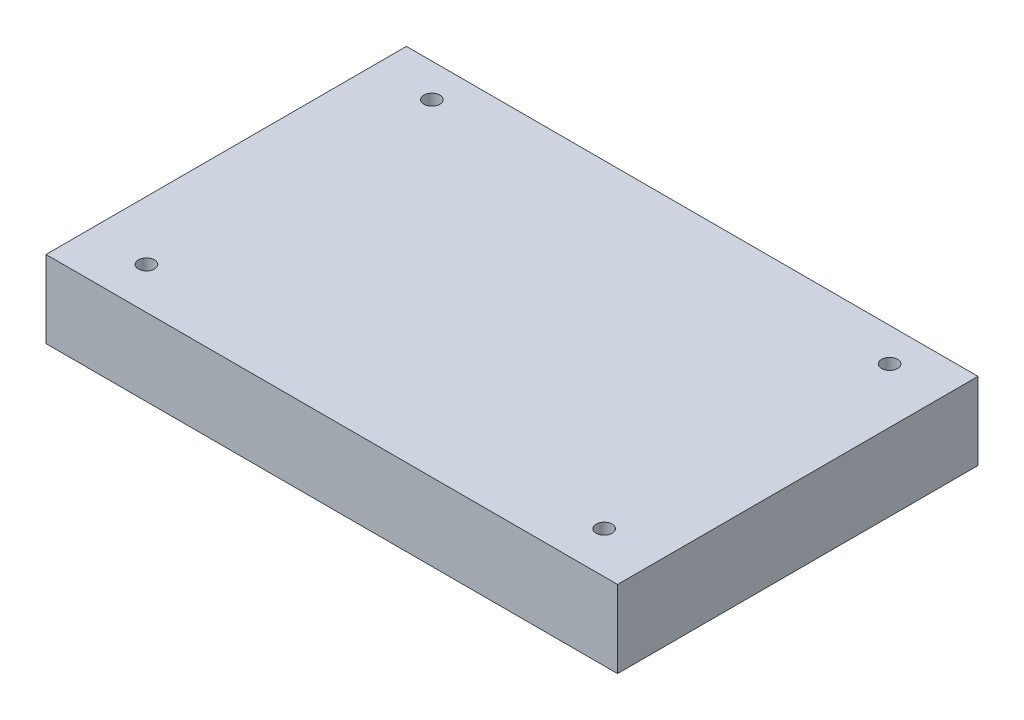
ISO-10303-21;
HEADER;
FILE_DESCRIPTION(('STEP AP214'),'2;1');
FILE_NAME('part.step','',(''),(''),'','','');
FILE_SCHEMA(('AUTOMOTIVE_DESIGN { 1 0 10303 214 1 1 1 1 }'));
ENDSEC;
DATA;
#1=APPLICATION_CONTEXT('core data for automotive mechanical design processes');
#2=APPLICATION_PROTOCOL_DEFINITION('international standard','automotive_design',2000,#1);
#3=PRODUCT_CONTEXT('',#1,'mechanical');
#4=PRODUCT('Part','Part','',(#3));
#5=PRODUCT_RELATED_PRODUCT_CATEGORY('part','',(#4));
#6=PRODUCT_DEFINITION_FORMATION('','',#4);
#7=PRODUCT_DEFINITION_CONTEXT('part definition',#1,'design');
#8=PRODUCT_DEFINITION('design','',#6,#7);
#9=PRODUCT_DEFINITION_SHAPE('','',#8);
#10=(LENGTH_UNIT() NAMED_UNIT(*) SI_UNIT(.MILLI.,.METRE.));
#11=(NAMED_UNIT(*) PLANE_ANGLE_UNIT() SI_UNIT($,.RADIAN.));
#12=(NAMED_UNIT(*) SI_UNIT($,.STERADIAN.) SOLID_ANGLE_UNIT());
#13=UNCERTAINTY_MEASURE_WITH_UNIT(LENGTH_MEASURE(1.E-05),#10,'distance_accuracy_value','');
#14=(GEOMETRIC_REPRESENTATION_CONTEXT(3) GLOBAL_UNCERTAINTY_ASSIGNED_CONTEXT((#13)) GLOBAL_UNIT_ASSIGNED_CONTEXT((#10,
#11,#12)) REPRESENTATION_CONTEXT('',''));
#15=CARTESIAN_POINT('',(0.,0.,0.));
#16=DIRECTION('',(0.,0.,1.));
#17=DIRECTION('',(1.,0.,0.));
#18=AXIS2_PLACEMENT_3D('',#15,#16,#17);
#19=CARTESIAN_POINT('',(55.5,15.,-35.));
#20=DIRECTION('',(-1.,0.,0.));
#21=DIRECTION('',(0.,0.,1.));
#22=AXIS2_PLACEMENT_3D('',#19,#20,#21);
#23=PLANE('',#22);
#24=DIRECTION('',(0.,0.,-1.));
#25=VECTOR('',#24,1.);
#26=CARTESIAN_POINT('',(55.5,0.,-35.));
#27=LINE('',#26,#25);
#28=CARTESIAN_POINT('',(55.5,0.,35.));
#29=VERTEX_POINT('',#28);
#30=CARTESIAN_POINT('',(55.5,0.,-35.));
#31=VERTEX_POINT('',#30);
#32=EDGE_CURVE('E96',#29,#31,#27,.T.);
#33=ORIENTED_EDGE('',*,*,#32,.T.);
#34=DIRECTION('',(0.,-1.,0.));
#35=VECTOR('',#34,1.);
#36=CARTESIAN_POINT('',(55.5,15.,-35.));
#37=LINE('',#36,#35);
#38=CARTESIAN_POINT('',(55.5,15.,-35.));
#39=VERTEX_POINT('',#38);
#40=EDGE_CURVE('E11',#39,#31,#37,.T.);
#41=ORIENTED_EDGE('',*,*,#40,.F.);
#42=DIRECTION('',(0.,0.,-1.));
#43=VECTOR('',#42,1.);
#44=CARTESIAN_POINT('',(55.5,15.,-35.));
#45=LINE('',#44,#43);
#46=CARTESIAN_POINT('',(55.5,15.,35.));
#47=VERTEX_POINT('',#46);
#48=EDGE_CURVE('E84',#47,#39,#45,.T.);
#49=ORIENTED_EDGE('',*,*,#48,.F.);
#50=DIRECTION('',(0.,-1.,0.));
#51=VECTOR('',#50,1.);
#52=CARTESIAN_POINT('',(55.5,15.,35.));
#53=LINE('',#52,#51);
#54=EDGE_CURVE('E92',#47,#29,#53,.T.);
#55=ORIENTED_EDGE('',*,*,#54,.T.);
#56=EDGE_LOOP('',(#33,#41,#49,#55));
#57=FACE_BOUND('',#56,.T.);
#58=ADVANCED_FACE('F33',(#57),#23,.F.);
#59=CARTESIAN_POINT('',(-55.5,15.,-35.));
#60=DIRECTION('',(0.,0.,1.));
#61=DIRECTION('',(1.,0.,0.));
#62=AXIS2_PLACEMENT_3D('',#59,#60,#61);
#63=PLANE('',#62);
#64=DIRECTION('',(-1.,0.,0.));
#65=VECTOR('',#64,1.);
#66=CARTESIAN_POINT('',(-55.5,0.,-35.));
#67=LINE('',#66,#65);
#68=CARTESIAN_POINT('',(-55.5,0.,-35.));
#69=VERTEX_POINT('',#68);
#70=EDGE_CURVE('E88',#31,#69,#67,.T.);
#71=ORIENTED_EDGE('',*,*,#70,.T.);
#72=DIRECTION('',(0.,-1.,0.));
#73=VECTOR('',#72,1.);
#74=CARTESIAN_POINT('',(-55.5,15.,-35.));
#75=LINE('',#74,#73);
#76=CARTESIAN_POINT('',(-55.5,15.,-35.));
#77=VERTEX_POINT('',#76);
#78=EDGE_CURVE('E41',#77,#69,#75,.T.);
#79=ORIENTED_EDGE('',*,*,#78,.F.);
#80=DIRECTION('',(-1.,0.,0.));
#81=VECTOR('',#80,1.);
#82=CARTESIAN_POINT('',(-55.5,15.,-35.));
#83=LINE('',#82,#81);
#84=EDGE_CURVE('E79',#39,#77,#83,.T.);
#85=ORIENTED_EDGE('',*,*,#84,.F.);
#86=ORIENTED_EDGE('',*,*,#40,.T.);
#87=EDGE_LOOP('',(#71,#79,#85,#86));
#88=FACE_BOUND('',#87,.T.);
#89=ADVANCED_FACE('F87',(#88),#63,.F.);
#90=CARTESIAN_POINT('',(-55.5,15.,-35.));
#91=DIRECTION('',(1.,0.,0.));
#92=DIRECTION('',(0.,0.,-1.));
#93=AXIS2_PLACEMENT_3D('',#90,#91,#92);
#94=PLANE('',#93);
#95=DIRECTION('',(0.,0.,1.));
#96=VECTOR('',#95,1.);
#97=CARTESIAN_POINT('',(-55.5,0.,-35.));
#98=LINE('',#97,#96);
#99=CARTESIAN_POINT('',(-55.5,0.,35.));
#100=VERTEX_POINT('',#99);
#101=EDGE_CURVE('E66',#69,#100,#98,.T.);
#102=ORIENTED_EDGE('',*,*,#101,.T.);
#103=DIRECTION('',(0.,-1.,0.));
#104=VECTOR('',#103,1.);
#105=CARTESIAN_POINT('',(-55.5,15.,35.));
#106=LINE('',#105,#104);
#107=CARTESIAN_POINT('',(-55.5,15.,35.));
#108=VERTEX_POINT('',#107);
#109=EDGE_CURVE('E89',#108,#100,#106,.T.);
#110=ORIENTED_EDGE('',*,*,#109,.F.);
#111=DIRECTION('',(0.,0.,1.));
#112=VECTOR('',#111,1.);
#113=CARTESIAN_POINT('',(-55.5,15.,-35.));
#114=LINE('',#113,#112);
#115=EDGE_CURVE('E82',#77,#108,#114,.T.);
#116=ORIENTED_EDGE('',*,*,#115,.F.);
#117=ORIENTED_EDGE('',*,*,#78,.T.);
#118=EDGE_LOOP('',(#102,#110,#116,#117));
#119=FACE_BOUND('',#118,.T.);
#120=ADVANCED_FACE('F90',(#119),#94,.F.);
#121=CARTESIAN_POINT('',(-55.5,15.,35.));
#122=DIRECTION('',(0.,0.,-1.));
#123=DIRECTION('',(-1.,0.,0.));
#124=AXIS2_PLACEMENT_3D('',#121,#122,#123);
#125=PLANE('',#124);
#126=DIRECTION('',(1.,0.,0.));
#127=VECTOR('',#126,1.);
#128=CARTESIAN_POINT('',(-55.5,0.,35.));
#129=LINE('',#128,#127);
#130=EDGE_CURVE('E72',#100,#29,#129,.T.);
#131=ORIENTED_EDGE('',*,*,#130,.T.);
#132=ORIENTED_EDGE('',*,*,#54,.F.);
#133=DIRECTION('',(1.,0.,0.));
#134=VECTOR('',#133,1.);
#135=CARTESIAN_POINT('',(-55.5,15.,35.));
#136=LINE('',#135,#134);
#137=EDGE_CURVE('E49',#108,#47,#136,.T.);
#138=ORIENTED_EDGE('',*,*,#137,.F.);
#139=ORIENTED_EDGE('',*,*,#109,.T.);
#140=EDGE_LOOP('',(#131,#132,#138,#139));
#141=FACE_BOUND('',#140,.T.);
#142=ADVANCED_FACE('F104',(#141),#125,.F.);
#143=CARTESIAN_POINT('',(0.,15.,0.));
#144=DIRECTION('',(0.,1.,0.));
#145=DIRECTION('',(0.,0.,1.));
#146=AXIS2_PLACEMENT_3D('',#143,#144,#145);
#147=PLANE('',#146);
#148=CARTESIAN_POINT('',(44.825,15.,-28.505));
#149=DIRECTION('',(0.,1.,0.));
#150=DIRECTION('',(0.,0.,1.));
#151=AXIS2_PLACEMENT_3D('',#148,#149,#150);
#152=CIRCLE('',#151,1.555);
#153=CARTESIAN_POINT('',(44.825,15.,-26.95));
#154=VERTEX_POINT('',#153);
#155=EDGE_CURVE('E128',#154,#154,#152,.T.);
#156=ORIENTED_EDGE('',*,*,#155,.F.);
#157=EDGE_LOOP('',(#156));
#158=FACE_BOUND('',#157,.T.);
#159=CARTESIAN_POINT('',(44.825,15.,26.925));
#160=DIRECTION('',(0.,1.,0.));
#161=DIRECTION('',(0.,0.,1.));
#162=AXIS2_PLACEMENT_3D('',#159,#160,#161);
#163=CIRCLE('',#162,1.555);
#164=CARTESIAN_POINT('',(44.825,15.,28.48));
#165=VERTEX_POINT('',#164);
#166=EDGE_CURVE('E122',#165,#165,#163,.T.);
#167=ORIENTED_EDGE('',*,*,#166,.F.);
#168=EDGE_LOOP('',(#167));
#169=FACE_BOUND('',#168,.T.);
#170=CARTESIAN_POINT('',(-44.065,15.,26.925));
#171=DIRECTION('',(0.,1.,0.));
#172=DIRECTION('',(0.,0.,1.));
#173=AXIS2_PLACEMENT_3D('',#170,#171,#172);
#174=CIRCLE('',#173,1.555);
#175=CARTESIAN_POINT('',(-44.065,15.,28.48));
#176=VERTEX_POINT('',#175);
#177=EDGE_CURVE('E116',#176,#176,#174,.T.);
#178=ORIENTED_EDGE('',*,*,#177,.F.);
#179=EDGE_LOOP('',(#178));
#180=FACE_BOUND('',#179,.T.);
#181=CARTESIAN_POINT('',(-44.065,15.,-28.505));
#182=DIRECTION('',(0.,1.,0.));
#183=DIRECTION('',(0.,0.,1.));
#184=AXIS2_PLACEMENT_3D('',#181,#182,#183);
#185=CIRCLE('',#184,1.555);
#186=CARTESIAN_POINT('',(-44.065,15.,-26.95));
#187=VERTEX_POINT('',#186);
#188=EDGE_CURVE('E110',#187,#187,#185,.T.);
#189=ORIENTED_EDGE('',*,*,#188,.F.);
#190=EDGE_LOOP('',(#189));
#191=FACE_BOUND('',#190,.T.);
#192=ORIENTED_EDGE('',*,*,#48,.T.);
#193=ORIENTED_EDGE('',*,*,#84,.T.);
#194=ORIENTED_EDGE('',*,*,#115,.T.);
#195=ORIENTED_EDGE('',*,*,#137,.T.);
#196=EDGE_LOOP('',(#192,#193,#194,#195));
#197=FACE_BOUND('',#196,.T.);
#198=ADVANCED_FACE('F80',(#158,#169,#180,#191,#197),#147,.T.);
#199=CARTESIAN_POINT('',(0.,0.,0.));
#200=DIRECTION('',(0.,1.,0.));
#201=DIRECTION('',(0.,0.,1.));
#202=AXIS2_PLACEMENT_3D('',#199,#200,#201);
#203=PLANE('',#202);
#204=CARTESIAN_POINT('',(44.825,0.,-28.505));
#205=DIRECTION('',(0.,1.,0.));
#206=DIRECTION('',(0.,0.,1.));
#207=AXIS2_PLACEMENT_3D('',#204,#205,#206);
#208=CIRCLE('',#207,1.555);
#209=CARTESIAN_POINT('',(44.825,0.,-26.95));
#210=VERTEX_POINT('',#209);
#211=EDGE_CURVE('E125',#210,#210,#208,.T.);
#212=ORIENTED_EDGE('',*,*,#211,.T.);
#213=EDGE_LOOP('',(#212));
#214=FACE_BOUND('',#213,.T.);
#215=CARTESIAN_POINT('',(44.825,0.,26.925));
#216=DIRECTION('',(0.,1.,0.));
#217=DIRECTION('',(0.,0.,1.));
#218=AXIS2_PLACEMENT_3D('',#215,#216,#217);
#219=CIRCLE('',#218,1.555);
#220=CARTESIAN_POINT('',(44.825,0.,28.48));
#221=VERTEX_POINT('',#220);
#222=EDGE_CURVE('E119',#221,#221,#219,.T.);
#223=ORIENTED_EDGE('',*,*,#222,.T.);
#224=EDGE_LOOP('',(#223));
#225=FACE_BOUND('',#224,.T.);
#226=CARTESIAN_POINT('',(-44.065,0.,26.925));
#227=DIRECTION('',(0.,1.,0.));
#228=DIRECTION('',(0.,0.,1.));
#229=AXIS2_PLACEMENT_3D('',#226,#227,#228);
#230=CIRCLE('',#229,1.555);
#231=CARTESIAN_POINT('',(-44.065,0.,28.48));
#232=VERTEX_POINT('',#231);
#233=EDGE_CURVE('E113',#232,#232,#230,.T.);
#234=ORIENTED_EDGE('',*,*,#233,.T.);
#235=EDGE_LOOP('',(#234));
#236=FACE_BOUND('',#235,.T.);
#237=CARTESIAN_POINT('',(-44.065,0.,-28.505));
#238=DIRECTION('',(0.,1.,0.));
#239=DIRECTION('',(0.,0.,1.));
#240=AXIS2_PLACEMENT_3D('',#237,#238,#239);
#241=CIRCLE('',#240,1.555);
#242=CARTESIAN_POINT('',(-44.065,0.,-26.95));
#243=VERTEX_POINT('',#242);
#244=EDGE_CURVE('E99',#243,#243,#241,.T.);
#245=ORIENTED_EDGE('',*,*,#244,.T.);
#246=EDGE_LOOP('',(#245));
#247=FACE_BOUND('',#246,.T.);
#248=ORIENTED_EDGE('',*,*,#32,.F.);
#249=ORIENTED_EDGE('',*,*,#130,.F.);
#250=ORIENTED_EDGE('',*,*,#101,.F.);
#251=ORIENTED_EDGE('',*,*,#70,.F.);
#252=EDGE_LOOP('',(#248,#249,#250,#251));
#253=FACE_BOUND('',#252,.T.);
#254=ADVANCED_FACE('F107',(#214,#225,#236,#247,#253),#203,.F.);
#255=CARTESIAN_POINT('',(-44.065,0.,-28.505));
#256=DIRECTION('',(0.,1.,0.));
#257=DIRECTION('',(0.,0.,1.));
#258=AXIS2_PLACEMENT_3D('',#255,#256,#257);
#259=CYLINDRICAL_SURFACE('',#258,1.555);
#260=ORIENTED_EDGE('',*,*,#244,.F.);
#261=EDGE_LOOP('',(#260));
#262=FACE_BOUND('',#261,.T.);
#263=ORIENTED_EDGE('',*,*,#188,.T.);
#264=EDGE_LOOP('',(#263));
#265=FACE_BOUND('',#264,.T.);
#266=ADVANCED_FACE('F152',(#262,#265),#259,.F.);
#267=CARTESIAN_POINT('',(-44.065,0.,26.925));
#268=DIRECTION('',(0.,1.,0.));
#269=DIRECTION('',(0.,0.,1.));
#270=AXIS2_PLACEMENT_3D('',#267,#268,#269);
#271=CYLINDRICAL_SURFACE('',#270,1.555);
#272=ORIENTED_EDGE('',*,*,#233,.F.);
#273=EDGE_LOOP('',(#272));
#274=FACE_BOUND('',#273,.T.);
#275=ORIENTED_EDGE('',*,*,#177,.T.);
#276=EDGE_LOOP('',(#275));
#277=FACE_BOUND('',#276,.T.);
#278=ADVANCED_FACE('F154',(#274,#277),#271,.F.);
#279=CARTESIAN_POINT('',(44.825,0.,26.925));
#280=DIRECTION('',(0.,1.,0.));
#281=DIRECTION('',(0.,0.,1.));
#282=AXIS2_PLACEMENT_3D('',#279,#280,#281);
#283=CYLINDRICAL_SURFACE('',#282,1.555);
#284=ORIENTED_EDGE('',*,*,#222,.F.);
#285=EDGE_LOOP('',(#284));
#286=FACE_BOUND('',#285,.T.);
#287=ORIENTED_EDGE('',*,*,#166,.T.);
#288=EDGE_LOOP('',(#287));
#289=FACE_BOUND('',#288,.T.);
#290=ADVANCED_FACE('F139',(#286,#289),#283,.F.);
#291=CARTESIAN_POINT('',(44.825,0.,-28.505));
#292=DIRECTION('',(0.,1.,0.));
#293=DIRECTION('',(0.,0.,1.));
#294=AXIS2_PLACEMENT_3D('',#291,#292,#293);
#295=CYLINDRICAL_SURFACE('',#294,1.555);
#296=ORIENTED_EDGE('',*,*,#211,.F.);
#297=EDGE_LOOP('',(#296));
#298=FACE_BOUND('',#297,.T.);
#299=ORIENTED_EDGE('',*,*,#155,.T.);
#300=EDGE_LOOP('',(#299));
#301=FACE_BOUND('',#300,.T.);
#302=ADVANCED_FACE('F136',(#298,#301),#295,.F.);
#303=CLOSED_SHELL('',(#58,#89,#120,#142,#198,#254,#266,#278,#290,#302));
#304=MANIFOLD_SOLID_BREP('B2',#303);
#305=ADVANCED_BREP_SHAPE_REPRESENTATION('',(#18,#304),#14);
#306=SHAPE_DEFINITION_REPRESENTATION(#9,#305);
ENDSEC;
END-ISO-10303-21;
